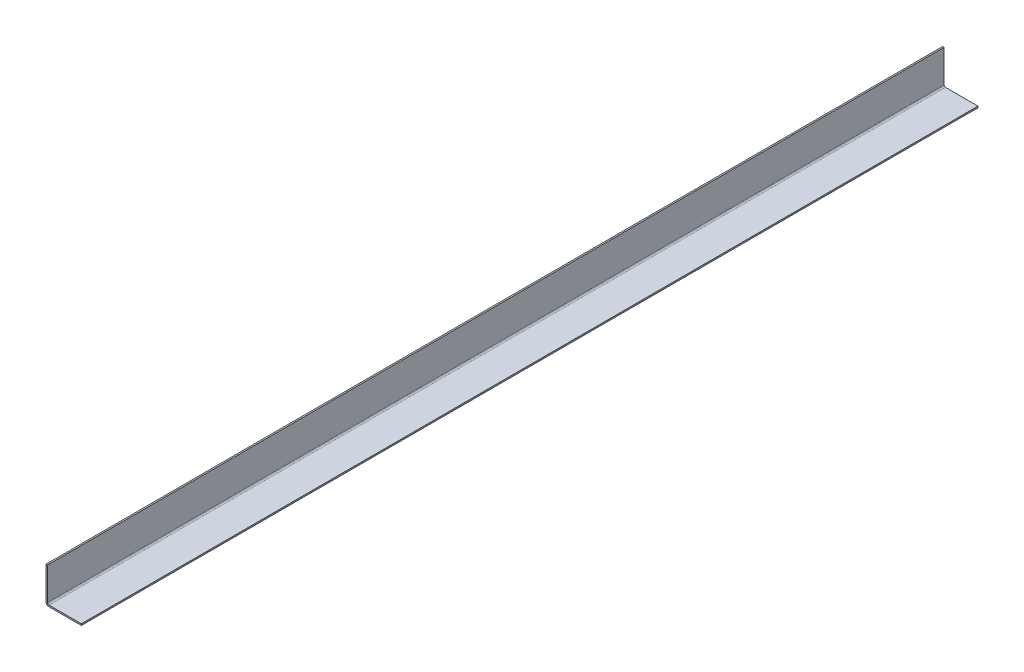
ISO-10303-21;
HEADER;
FILE_DESCRIPTION(('STEP AP214'),'2;1');
FILE_NAME('part.step','',(''),(''),'','','');
FILE_SCHEMA(('AUTOMOTIVE_DESIGN { 1 0 10303 214 1 1 1 1 }'));
ENDSEC;
DATA;
#1=APPLICATION_CONTEXT('core data for automotive mechanical design processes');
#2=APPLICATION_PROTOCOL_DEFINITION('international standard','automotive_design',2000,#1);
#3=PRODUCT_CONTEXT('',#1,'mechanical');
#4=PRODUCT('Part','Part','',(#3));
#5=PRODUCT_RELATED_PRODUCT_CATEGORY('part','',(#4));
#6=PRODUCT_DEFINITION_FORMATION('','',#4);
#7=PRODUCT_DEFINITION_CONTEXT('part definition',#1,'design');
#8=PRODUCT_DEFINITION('design','',#6,#7);
#9=PRODUCT_DEFINITION_SHAPE('','',#8);
#10=(LENGTH_UNIT() NAMED_UNIT(*) SI_UNIT(.MILLI.,.METRE.));
#11=(NAMED_UNIT(*) PLANE_ANGLE_UNIT() SI_UNIT($,.RADIAN.));
#12=(NAMED_UNIT(*) SI_UNIT($,.STERADIAN.) SOLID_ANGLE_UNIT());
#13=UNCERTAINTY_MEASURE_WITH_UNIT(LENGTH_MEASURE(1.E-05),#10,'distance_accuracy_value','');
#14=(GEOMETRIC_REPRESENTATION_CONTEXT(3) GLOBAL_UNCERTAINTY_ASSIGNED_CONTEXT((#13)) GLOBAL_UNIT_ASSIGNED_CONTEXT((#10,
#11,#12)) REPRESENTATION_CONTEXT('',''));
#15=CARTESIAN_POINT('',(0.,0.,0.));
#16=DIRECTION('',(0.,0.,1.));
#17=DIRECTION('',(1.,0.,0.));
#18=AXIS2_PLACEMENT_3D('',#15,#16,#17);
#19=CARTESIAN_POINT('',(6.35,-34.925,965.2));
#20=DIRECTION('',(0.,1.,0.));
#21=DIRECTION('',(0.,0.,1.));
#22=AXIS2_PLACEMENT_3D('',#19,#20,#21);
#23=PLANE('',#22);
#24=DIRECTION('',(1.,0.,0.));
#25=VECTOR('',#24,1.);
#26=CARTESIAN_POINT('',(41.275,-34.925,-965.2));
#27=LINE('',#26,#25);
#28=CARTESIAN_POINT('',(76.2,-34.925,-965.2));
#29=VERTEX_POINT('',#28);
#30=CARTESIAN_POINT('',(6.35,-34.925,-965.2));
#31=VERTEX_POINT('',#30);
#32=EDGE_CURVE('E159',#29,#31,#27,.F.);
#33=ORIENTED_EDGE('',*,*,#32,.T.);
#34=DIRECTION('',(0.,0.,-1.));
#35=VECTOR('',#34,1.);
#36=CARTESIAN_POINT('',(6.35,-34.925,965.2));
#37=LINE('',#36,#35);
#38=CARTESIAN_POINT('',(6.35,-34.925,965.2));
#39=VERTEX_POINT('',#38);
#40=EDGE_CURVE('E163',#31,#39,#37,.F.);
#41=ORIENTED_EDGE('',*,*,#40,.T.);
#42=DIRECTION('',(-1.,0.,0.));
#43=VECTOR('',#42,1.);
#44=CARTESIAN_POINT('',(41.275,-34.925,965.2));
#45=LINE('',#44,#43);
#46=CARTESIAN_POINT('',(76.2,-34.925,965.2));
#47=VERTEX_POINT('',#46);
#48=EDGE_CURVE('E151',#39,#47,#45,.F.);
#49=ORIENTED_EDGE('',*,*,#48,.T.);
#50=DIRECTION('',(0.,0.,1.));
#51=VECTOR('',#50,1.);
#52=CARTESIAN_POINT('',(76.2,-34.925,-7.03863634043856E-12));
#53=LINE('',#52,#51);
#54=EDGE_CURVE('E160',#47,#29,#53,.F.);
#55=ORIENTED_EDGE('',*,*,#54,.T.);
#56=EDGE_LOOP('',(#33,#41,#49,#55));
#57=FACE_BOUND('',#56,.T.);
#58=ADVANCED_FACE('F17',(#57),#23,.T.);
#59=CARTESIAN_POINT('',(6.35,-31.75,965.2));
#60=DIRECTION('',(0.,0.,-1.));
#61=DIRECTION('',(-1.,0.,0.));
#62=AXIS2_PLACEMENT_3D('',#59,#60,#61);
#63=CYLINDRICAL_SURFACE('',#62,3.175);
#64=ORIENTED_EDGE('',*,*,#40,.F.);
#65=CARTESIAN_POINT('',(6.35,-31.75,-965.2));
#66=DIRECTION('',(0.,0.,-1.));
#67=DIRECTION('',(-1.,0.,0.));
#68=AXIS2_PLACEMENT_3D('',#65,#66,#67);
#69=CIRCLE('',#68,3.175);
#70=CARTESIAN_POINT('',(3.175,-31.75,-965.2));
#71=VERTEX_POINT('',#70);
#72=EDGE_CURVE('E155',#31,#71,#69,.T.);
#73=ORIENTED_EDGE('',*,*,#72,.T.);
#74=DIRECTION('',(0.,0.,-1.));
#75=VECTOR('',#74,1.);
#76=CARTESIAN_POINT('',(3.175,-31.75,0.));
#77=LINE('',#76,#75);
#78=CARTESIAN_POINT('',(3.175,-31.75,965.2));
#79=VERTEX_POINT('',#78);
#80=EDGE_CURVE('E127',#79,#71,#77,.T.);
#81=ORIENTED_EDGE('',*,*,#80,.F.);
#82=CARTESIAN_POINT('',(6.35,-31.75,965.2));
#83=DIRECTION('',(0.,0.,-1.));
#84=DIRECTION('',(-1.,0.,0.));
#85=AXIS2_PLACEMENT_3D('',#82,#83,#84);
#86=CIRCLE('',#85,3.175);
#87=EDGE_CURVE('E20',#79,#39,#86,.F.);
#88=ORIENTED_EDGE('',*,*,#87,.T.);
#89=EDGE_LOOP('',(#64,#73,#81,#88));
#90=FACE_BOUND('',#89,.T.);
#91=ADVANCED_FACE('F180',(#90),#63,.F.);
#92=CARTESIAN_POINT('',(76.2,-36.5125,-7.03863634043856E-12));
#93=DIRECTION('',(-1.,0.,0.));
#94=DIRECTION('',(0.,0.,1.));
#95=AXIS2_PLACEMENT_3D('',#92,#93,#94);
#96=PLANE('',#95);
#97=DIRECTION('',(0.,1.,0.));
#98=VECTOR('',#97,1.);
#99=CARTESIAN_POINT('',(76.2,-36.5125,-965.2));
#100=LINE('',#99,#98);
#101=CARTESIAN_POINT('',(76.2,-38.1,-965.2));
#102=VERTEX_POINT('',#101);
#103=EDGE_CURVE('E99',#102,#29,#100,.T.);
#104=ORIENTED_EDGE('',*,*,#103,.T.);
#105=ORIENTED_EDGE('',*,*,#54,.F.);
#106=DIRECTION('',(0.,1.,0.));
#107=VECTOR('',#106,1.);
#108=CARTESIAN_POINT('',(76.2,-36.5125,965.2));
#109=LINE('',#108,#107);
#110=CARTESIAN_POINT('',(76.2,-38.1,965.2));
#111=VERTEX_POINT('',#110);
#112=EDGE_CURVE('E129',#47,#111,#109,.F.);
#113=ORIENTED_EDGE('',*,*,#112,.T.);
#114=DIRECTION('',(0.,0.,1.));
#115=VECTOR('',#114,1.);
#116=CARTESIAN_POINT('',(76.2,-38.1,965.2));
#117=LINE('',#116,#115);
#118=EDGE_CURVE('E103',#111,#102,#117,.F.);
#119=ORIENTED_EDGE('',*,*,#118,.T.);
#120=EDGE_LOOP('',(#104,#105,#113,#119));
#121=FACE_BOUND('',#120,.T.);
#122=ADVANCED_FACE('F210',(#121),#96,.F.);
#123=CARTESIAN_POINT('',(3.175,0.,0.));
#124=DIRECTION('',(1.,0.,0.));
#125=DIRECTION('',(0.,0.,-1.));
#126=AXIS2_PLACEMENT_3D('',#123,#124,#125);
#127=PLANE('',#126);
#128=DIRECTION('',(0.,0.,-1.));
#129=VECTOR('',#128,1.);
#130=CARTESIAN_POINT('',(3.175,38.1,-7.03863634043856E-12));
#131=LINE('',#130,#129);
#132=CARTESIAN_POINT('',(3.175,38.1,-965.2));
#133=VERTEX_POINT('',#132);
#134=CARTESIAN_POINT('',(3.175,38.1,965.2));
#135=VERTEX_POINT('',#134);
#136=EDGE_CURVE('E67',#133,#135,#131,.F.);
#137=ORIENTED_EDGE('',*,*,#136,.T.);
#138=DIRECTION('',(0.,1.,0.));
#139=VECTOR('',#138,1.);
#140=CARTESIAN_POINT('',(3.175,0.,965.2));
#141=LINE('',#140,#139);
#142=EDGE_CURVE('E122',#135,#79,#141,.F.);
#143=ORIENTED_EDGE('',*,*,#142,.T.);
#144=ORIENTED_EDGE('',*,*,#80,.T.);
#145=DIRECTION('',(0.,1.,0.));
#146=VECTOR('',#145,1.);
#147=CARTESIAN_POINT('',(3.175,0.,-965.2));
#148=LINE('',#147,#146);
#149=EDGE_CURVE('E115',#71,#133,#148,.T.);
#150=ORIENTED_EDGE('',*,*,#149,.T.);
#151=EDGE_LOOP('',(#137,#143,#144,#150));
#152=FACE_BOUND('',#151,.T.);
#153=ADVANCED_FACE('F185',(#152),#127,.T.);
#154=CARTESIAN_POINT('',(6.35,-38.1,965.2));
#155=DIRECTION('',(0.,1.,0.));
#156=DIRECTION('',(0.,0.,1.));
#157=AXIS2_PLACEMENT_3D('',#154,#155,#156);
#158=PLANE('',#157);
#159=DIRECTION('',(0.,0.,-1.));
#160=VECTOR('',#159,1.);
#161=CARTESIAN_POINT('',(6.35,-38.1,965.2));
#162=LINE('',#161,#160);
#163=CARTESIAN_POINT('',(6.35,-38.1,-965.2));
#164=VERTEX_POINT('',#163);
#165=CARTESIAN_POINT('',(6.35,-38.1,965.2));
#166=VERTEX_POINT('',#165);
#167=EDGE_CURVE('E90',#164,#166,#162,.F.);
#168=ORIENTED_EDGE('',*,*,#167,.F.);
#169=DIRECTION('',(1.,0.,0.));
#170=VECTOR('',#169,1.);
#171=CARTESIAN_POINT('',(6.35,-38.1,-965.2));
#172=LINE('',#171,#170);
#173=EDGE_CURVE('E95',#102,#164,#172,.F.);
#174=ORIENTED_EDGE('',*,*,#173,.F.);
#175=ORIENTED_EDGE('',*,*,#118,.F.);
#176=DIRECTION('',(1.,0.,0.));
#177=VECTOR('',#176,1.);
#178=CARTESIAN_POINT('',(6.35,-38.1,965.2));
#179=LINE('',#178,#177);
#180=EDGE_CURVE('E102',#166,#111,#179,.T.);
#181=ORIENTED_EDGE('',*,*,#180,.F.);
#182=EDGE_LOOP('',(#168,#174,#175,#181));
#183=FACE_BOUND('',#182,.T.);
#184=ADVANCED_FACE('F105',(#183),#158,.F.);
#185=CARTESIAN_POINT('',(1.5875,0.,-965.2));
#186=DIRECTION('',(0.,0.,1.));
#187=DIRECTION('',(1.,0.,0.));
#188=AXIS2_PLACEMENT_3D('',#185,#186,#187);
#189=PLANE('',#188);
#190=DIRECTION('',(0.,1.,0.));
#191=VECTOR('',#190,1.);
#192=CARTESIAN_POINT('',(0.,0.,-965.2));
#193=LINE('',#192,#191);
#194=CARTESIAN_POINT('',(0.,-31.75,-965.2));
#195=VERTEX_POINT('',#194);
#196=CARTESIAN_POINT('',(0.,38.1,-965.2));
#197=VERTEX_POINT('',#196);
#198=EDGE_CURVE('E107',#195,#197,#193,.T.);
#199=ORIENTED_EDGE('',*,*,#198,.T.);
#200=DIRECTION('',(1.,0.,0.));
#201=VECTOR('',#200,1.);
#202=CARTESIAN_POINT('',(1.5875,38.1,-965.2));
#203=LINE('',#202,#201);
#204=EDGE_CURVE('E135',#197,#133,#203,.T.);
#205=ORIENTED_EDGE('',*,*,#204,.T.);
#206=ORIENTED_EDGE('',*,*,#149,.F.);
#207=ORIENTED_EDGE('',*,*,#72,.F.);
#208=ORIENTED_EDGE('',*,*,#32,.F.);
#209=ORIENTED_EDGE('',*,*,#103,.F.);
#210=ORIENTED_EDGE('',*,*,#173,.T.);
#211=CARTESIAN_POINT('',(6.35,-31.75,-965.2));
#212=DIRECTION('',(0.,0.,-1.));
#213=DIRECTION('',(-1.,0.,0.));
#214=AXIS2_PLACEMENT_3D('',#211,#212,#213);
#215=CIRCLE('',#214,6.35);
#216=EDGE_CURVE('E86',#195,#164,#215,.F.);
#217=ORIENTED_EDGE('',*,*,#216,.F.);
#218=EDGE_LOOP('',(#199,#205,#206,#207,#208,#209,#210,#217));
#219=FACE_BOUND('',#218,.T.);
#220=ADVANCED_FACE('F96',(#219),#189,.F.);
#221=CARTESIAN_POINT('',(1.5875,38.1,-7.03863634043856E-12));
#222=DIRECTION('',(0.,-1.,0.));
#223=DIRECTION('',(0.,0.,-1.));
#224=AXIS2_PLACEMENT_3D('',#221,#222,#223);
#225=PLANE('',#224);
#226=DIRECTION('',(-1.,0.,0.));
#227=VECTOR('',#226,1.);
#228=CARTESIAN_POINT('',(1.5875,38.1,965.2));
#229=LINE('',#228,#227);
#230=CARTESIAN_POINT('',(0.,38.1,965.2));
#231=VERTEX_POINT('',#230);
#232=EDGE_CURVE('E124',#231,#135,#229,.F.);
#233=ORIENTED_EDGE('',*,*,#232,.T.);
#234=ORIENTED_EDGE('',*,*,#136,.F.);
#235=ORIENTED_EDGE('',*,*,#204,.F.);
#236=DIRECTION('',(0.,0.,-1.));
#237=VECTOR('',#236,1.);
#238=CARTESIAN_POINT('',(0.,38.1,0.));
#239=LINE('',#238,#237);
#240=EDGE_CURVE('E109',#197,#231,#239,.F.);
#241=ORIENTED_EDGE('',*,*,#240,.T.);
#242=EDGE_LOOP('',(#233,#234,#235,#241));
#243=FACE_BOUND('',#242,.T.);
#244=ADVANCED_FACE('F187',(#243),#225,.F.);
#245=CARTESIAN_POINT('',(1.5875,0.,965.2));
#246=DIRECTION('',(0.,0.,-1.));
#247=DIRECTION('',(-1.,0.,0.));
#248=AXIS2_PLACEMENT_3D('',#245,#246,#247);
#249=PLANE('',#248);
#250=ORIENTED_EDGE('',*,*,#142,.F.);
#251=ORIENTED_EDGE('',*,*,#232,.F.);
#252=DIRECTION('',(0.,1.,0.));
#253=VECTOR('',#252,1.);
#254=CARTESIAN_POINT('',(0.,0.,965.2));
#255=LINE('',#254,#253);
#256=CARTESIAN_POINT('',(0.,-31.75,965.2));
#257=VERTEX_POINT('',#256);
#258=EDGE_CURVE('E26',#231,#257,#255,.F.);
#259=ORIENTED_EDGE('',*,*,#258,.T.);
#260=CARTESIAN_POINT('',(6.35,-31.75,965.2));
#261=DIRECTION('',(0.,0.,-1.));
#262=DIRECTION('',(-1.,0.,0.));
#263=AXIS2_PLACEMENT_3D('',#260,#261,#262);
#264=CIRCLE('',#263,6.35);
#265=EDGE_CURVE('E34',#166,#257,#264,.T.);
#266=ORIENTED_EDGE('',*,*,#265,.F.);
#267=ORIENTED_EDGE('',*,*,#180,.T.);
#268=ORIENTED_EDGE('',*,*,#112,.F.);
#269=ORIENTED_EDGE('',*,*,#48,.F.);
#270=ORIENTED_EDGE('',*,*,#87,.F.);
#271=EDGE_LOOP('',(#250,#251,#259,#266,#267,#268,#269,#270));
#272=FACE_BOUND('',#271,.T.);
#273=ADVANCED_FACE('F182',(#272),#249,.F.);
#274=CARTESIAN_POINT('',(6.35,-31.75,965.2));
#275=DIRECTION('',(0.,0.,-1.));
#276=DIRECTION('',(-1.,0.,0.));
#277=AXIS2_PLACEMENT_3D('',#274,#275,#276);
#278=CYLINDRICAL_SURFACE('',#277,6.35);
#279=ORIENTED_EDGE('',*,*,#216,.T.);
#280=ORIENTED_EDGE('',*,*,#167,.T.);
#281=ORIENTED_EDGE('',*,*,#265,.T.);
#282=DIRECTION('',(0.,0.,-1.));
#283=VECTOR('',#282,1.);
#284=CARTESIAN_POINT('',(0.,-31.75,0.));
#285=LINE('',#284,#283);
#286=EDGE_CURVE('E11',#257,#195,#285,.T.);
#287=ORIENTED_EDGE('',*,*,#286,.T.);
#288=EDGE_LOOP('',(#279,#280,#281,#287));
#289=FACE_BOUND('',#288,.T.);
#290=ADVANCED_FACE('F88',(#289),#278,.T.);
#291=CARTESIAN_POINT('',(0.,0.,0.));
#292=DIRECTION('',(1.,0.,0.));
#293=DIRECTION('',(0.,0.,-1.));
#294=AXIS2_PLACEMENT_3D('',#291,#292,#293);
#295=PLANE('',#294);
#296=ORIENTED_EDGE('',*,*,#258,.F.);
#297=ORIENTED_EDGE('',*,*,#240,.F.);
#298=ORIENTED_EDGE('',*,*,#198,.F.);
#299=ORIENTED_EDGE('',*,*,#286,.F.);
#300=EDGE_LOOP('',(#296,#297,#298,#299));
#301=FACE_BOUND('',#300,.T.);
#302=ADVANCED_FACE('F191',(#301),#295,.F.);
#303=CLOSED_SHELL('',(#58,#91,#122,#153,#184,#220,#244,#273,#290,#302));
#304=MANIFOLD_SOLID_BREP('B1',#303);
#305=ADVANCED_BREP_SHAPE_REPRESENTATION('',(#18,#304),#14);
#306=SHAPE_DEFINITION_REPRESENTATION(#9,#305);
ENDSEC;
END-ISO-10303-21;
